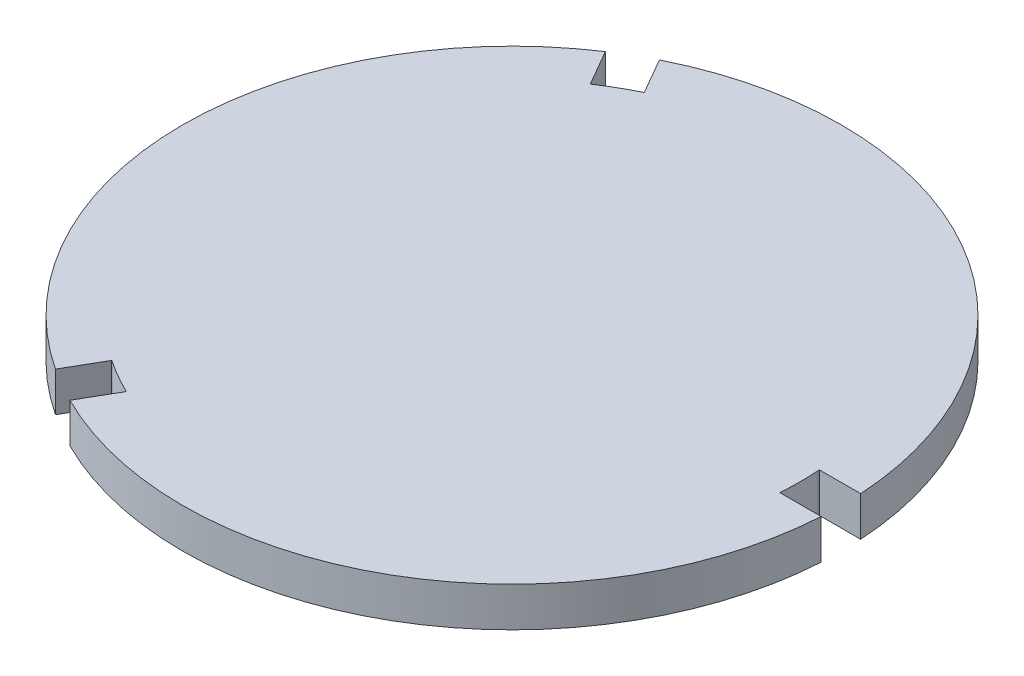
ISO-10303-21;
HEADER;
FILE_DESCRIPTION(('STEP AP214'),'2;1');
FILE_NAME('part.step','',(''),(''),'','','');
FILE_SCHEMA(('AUTOMOTIVE_DESIGN { 1 0 10303 214 1 1 1 1 }'));
ENDSEC;
DATA;
#1=APPLICATION_CONTEXT('core data for automotive mechanical design processes');
#2=APPLICATION_PROTOCOL_DEFINITION('international standard','automotive_design',2000,#1);
#3=PRODUCT_CONTEXT('',#1,'mechanical');
#4=PRODUCT('Part','Part','',(#3));
#5=PRODUCT_RELATED_PRODUCT_CATEGORY('part','',(#4));
#6=PRODUCT_DEFINITION_FORMATION('','',#4);
#7=PRODUCT_DEFINITION_CONTEXT('part definition',#1,'design');
#8=PRODUCT_DEFINITION('design','',#6,#7);
#9=PRODUCT_DEFINITION_SHAPE('','',#8);
#10=(LENGTH_UNIT() NAMED_UNIT(*) SI_UNIT(.MILLI.,.METRE.));
#11=(NAMED_UNIT(*) PLANE_ANGLE_UNIT() SI_UNIT($,.RADIAN.));
#12=(NAMED_UNIT(*) SI_UNIT($,.STERADIAN.) SOLID_ANGLE_UNIT());
#13=UNCERTAINTY_MEASURE_WITH_UNIT(LENGTH_MEASURE(1.E-05),#10,'distance_accuracy_value','');
#14=(GEOMETRIC_REPRESENTATION_CONTEXT(3) GLOBAL_UNCERTAINTY_ASSIGNED_CONTEXT((#13)) GLOBAL_UNIT_ASSIGNED_CONTEXT((#10,
#11,#12)) REPRESENTATION_CONTEXT('',''));
#15=CARTESIAN_POINT('',(0.,0.,0.));
#16=DIRECTION('',(0.,0.,1.));
#17=DIRECTION('',(1.,0.,0.));
#18=AXIS2_PLACEMENT_3D('',#15,#16,#17);
#19=CARTESIAN_POINT('',(0.,0.,0.));
#20=DIRECTION('',(0.,1.,0.));
#21=DIRECTION('',(-1.,0.,0.));
#22=AXIS2_PLACEMENT_3D('',#19,#20,#21);
#23=CYLINDRICAL_SURFACE('',#22,88.9);
#24=DIRECTION('',(0.,1.,0.));
#25=VECTOR('',#24,1.);
#26=CARTESIAN_POINT('',(-39.4204711900264,-1.54675011123543E-13,-79.6820961769725));
#27=LINE('',#26,#25);
#28=CARTESIAN_POINT('',(-39.4204711900234,-148.472222222158,-79.682096176974));
#29=VERTEX_POINT('',#28);
#30=CARTESIAN_POINT('',(-39.4204711900231,-136.280222222158,-79.6820961769741));
#31=VERTEX_POINT('',#30);
#32=EDGE_CURVE('E258',#29,#31,#27,.T.);
#33=ORIENTED_EDGE('',*,*,#32,.F.);
#34=CARTESIAN_POINT('',(0.,-148.472222222158,0.));
#35=DIRECTION('',(0.,1.,0.));
#36=DIRECTION('',(-1.,0.,0.));
#37=AXIS2_PLACEMENT_3D('',#34,#35,#36);
#38=CIRCLE('',#37,88.9);
#39=CARTESIAN_POINT('',(-49.2964839210414,-148.472222222158,-73.9801775682007));
#40=VERTEX_POINT('',#39);
#41=EDGE_CURVE('E259',#29,#40,#38,.T.);
#42=ORIENTED_EDGE('',*,*,#41,.T.);
#43=DIRECTION('',(0.,1.,0.));
#44=VECTOR('',#43,1.);
#45=CARTESIAN_POINT('',(-49.2964839210386,-1.55884473861481E-13,-73.9801775682026));
#46=LINE('',#45,#44);
#47=CARTESIAN_POINT('',(-49.2964839210416,-136.280222222158,-73.9801775682005));
#48=VERTEX_POINT('',#47);
#49=EDGE_CURVE('E51',#48,#40,#46,.F.);
#50=ORIENTED_EDGE('',*,*,#49,.F.);
#51=CARTESIAN_POINT('',(0.,-136.280222222158,0.));
#52=DIRECTION('',(0.,1.,0.));
#53=DIRECTION('',(-1.,0.,0.));
#54=AXIS2_PLACEMENT_3D('',#51,#52,#53);
#55=CIRCLE('',#54,88.9);
#56=EDGE_CURVE('E44',#31,#48,#55,.T.);
#57=ORIENTED_EDGE('',*,*,#56,.F.);
#58=EDGE_LOOP('',(#33,#42,#50,#57));
#59=FACE_BOUND('',#58,.T.);
#60=ADVANCED_FACE('F35',(#59),#23,.T.);
#61=DIRECTION('',(0.,1.,0.));
#62=VECTOR('',#61,1.);
#63=CARTESIAN_POINT('',(88.7169551110657,3.10559484985026E-13,5.70191860878083));
#64=LINE('',#63,#62);
#65=CARTESIAN_POINT('',(88.7169551110662,-148.472222222158,5.70191860877276));
#66=VERTEX_POINT('',#65);
#67=CARTESIAN_POINT('',(88.7169551110661,-136.280222222158,5.70191860877368));
#68=VERTEX_POINT('',#67);
#69=EDGE_CURVE('E254',#66,#68,#64,.T.);
#70=ORIENTED_EDGE('',*,*,#69,.F.);
#71=CARTESIAN_POINT('',(88.7169551110662,-148.472222222158,-5.70191860877276));
#72=VERTEX_POINT('',#71);
#73=EDGE_CURVE('E261',#66,#72,#38,.T.);
#74=ORIENTED_EDGE('',*,*,#73,.T.);
#75=DIRECTION('',(0.,1.,0.));
#76=VECTOR('',#75,1.);
#77=CARTESIAN_POINT('',(88.7169551110657,3.10559484985026E-13,-5.70191860878083));
#78=LINE('',#77,#76);
#79=CARTESIAN_POINT('',(88.7169551110661,-136.280222222158,-5.70191860877368));
#80=VERTEX_POINT('',#79);
#81=EDGE_CURVE('E251',#80,#72,#78,.F.);
#82=ORIENTED_EDGE('',*,*,#81,.F.);
#83=EDGE_CURVE('E43',#68,#80,#55,.T.);
#84=ORIENTED_EDGE('',*,*,#83,.F.);
#85=EDGE_LOOP('',(#70,#74,#82,#84));
#86=FACE_BOUND('',#85,.T.);
#87=ADVANCED_FACE('F325',(#86),#23,.T.);
#88=DIRECTION('',(0.,1.,0.));
#89=VECTOR('',#88,1.);
#90=CARTESIAN_POINT('',(-49.2964839210393,-1.55884473861484E-13,73.9801775682021));
#91=LINE('',#90,#89);
#92=CARTESIAN_POINT('',(-49.296483921042,-148.472222222158,73.9801775682003));
#93=VERTEX_POINT('',#92);
#94=CARTESIAN_POINT('',(-49.2964839210419,-136.280222222158,73.9801775682004));
#95=VERTEX_POINT('',#94);
#96=EDGE_CURVE('E248',#93,#95,#91,.T.);
#97=ORIENTED_EDGE('',*,*,#96,.F.);
#98=CARTESIAN_POINT('',(-39.4204711900249,-148.472222222158,79.6820961769733));
#99=VERTEX_POINT('',#98);
#100=EDGE_CURVE('E260',#93,#99,#38,.T.);
#101=ORIENTED_EDGE('',*,*,#100,.T.);
#102=DIRECTION('',(0.,1.,0.));
#103=VECTOR('',#102,1.);
#104=CARTESIAN_POINT('',(-39.4204711900277,-1.54675011123547E-13,79.6820961769719));
#105=LINE('',#104,#103);
#106=CARTESIAN_POINT('',(-39.420471190025,-136.280222222158,79.6820961769732));
#107=VERTEX_POINT('',#106);
#108=EDGE_CURVE('E245',#107,#99,#105,.F.);
#109=ORIENTED_EDGE('',*,*,#108,.F.);
#110=EDGE_CURVE('E11',#95,#107,#55,.T.);
#111=ORIENTED_EDGE('',*,*,#110,.F.);
#112=EDGE_LOOP('',(#97,#101,#109,#111));
#113=FACE_BOUND('',#112,.T.);
#114=ADVANCED_FACE('F306',(#113),#23,.T.);
#115=CARTESIAN_POINT('',(0.,-136.280222222158,0.));
#116=DIRECTION('',(0.,-1.,0.));
#117=DIRECTION('',(1.,0.,0.));
#118=AXIS2_PLACEMENT_3D('',#115,#116,#117);
#119=PLANE('',#118);
#120=DIRECTION('',(0.,0.,1.));
#121=VECTOR('',#120,1.);
#122=CARTESIAN_POINT('',(88.7169551110661,-136.280222222157,-6.096));
#123=LINE('',#122,#121);
#124=CARTESIAN_POINT('',(88.7169551110661,-136.280222222157,6.096));
#125=VERTEX_POINT('',#124);
#126=EDGE_CURVE('E198',#68,#125,#123,.T.);
#127=ORIENTED_EDGE('',*,*,#126,.F.);
#128=ORIENTED_EDGE('',*,*,#83,.T.);
#129=CARTESIAN_POINT('',(88.7169551110661,-136.280222222157,-6.096));
#130=VERTEX_POINT('',#129);
#131=EDGE_CURVE('E199',#130,#80,#123,.T.);
#132=ORIENTED_EDGE('',*,*,#131,.F.);
#133=DIRECTION('',(-1.,0.,0.));
#134=VECTOR('',#133,1.);
#135=CARTESIAN_POINT('',(101.416955111066,-136.280222222157,-6.096));
#136=LINE('',#135,#134);
#137=CARTESIAN_POINT('',(101.416955111066,-136.280222222157,-6.096));
#138=VERTEX_POINT('',#137);
#139=EDGE_CURVE('E195',#138,#130,#136,.T.);
#140=ORIENTED_EDGE('',*,*,#139,.F.);
#141=CARTESIAN_POINT('',(0.,-136.280222222158,0.));
#142=DIRECTION('',(0.,1.,0.));
#143=DIRECTION('',(-1.,0.,0.));
#144=AXIS2_PLACEMENT_3D('',#141,#142,#143);
#145=CIRCLE('',#144,101.6);
#146=CARTESIAN_POINT('',(-45.4291866940622,-136.280222222158,-90.8776595006498));
#147=VERTEX_POINT('',#146);
#148=EDGE_CURVE('E192',#138,#147,#145,.T.);
#149=ORIENTED_EDGE('',*,*,#148,.T.);
#150=DIRECTION('',(0.499999999999992,0.,0.866025403784443));
#151=VECTOR('',#150,1.);
#152=CARTESIAN_POINT('',(-45.4291866940623,-136.280222222158,-90.8776595006497));
#153=LINE('',#152,#151);
#154=CARTESIAN_POINT('',(-39.0791866940624,-136.280222222158,-79.8791368725873));
#155=VERTEX_POINT('',#154);
#156=EDGE_CURVE('E179',#147,#155,#153,.T.);
#157=ORIENTED_EDGE('',*,*,#156,.T.);
#158=DIRECTION('',(0.866025403784443,0.,-0.499999999999992));
#159=VECTOR('',#158,1.);
#160=CARTESIAN_POINT('',(-49.6377684170023,-136.280222222158,-73.7831368725874));
#161=LINE('',#160,#159);
#162=EDGE_CURVE('E180',#31,#155,#161,.T.);
#163=ORIENTED_EDGE('',*,*,#162,.F.);
#164=ORIENTED_EDGE('',*,*,#56,.T.);
#165=CARTESIAN_POINT('',(-49.6377684170023,-136.280222222158,-73.7831368725874));
#166=VERTEX_POINT('',#165);
#167=EDGE_CURVE('E162',#166,#48,#161,.T.);
#168=ORIENTED_EDGE('',*,*,#167,.F.);
#169=DIRECTION('',(0.499999999999992,0.,0.866025403784443));
#170=VECTOR('',#169,1.);
#171=CARTESIAN_POINT('',(-55.9877684170022,-136.280222222158,-84.7816595006498));
#172=LINE('',#171,#170);
#173=CARTESIAN_POINT('',(-55.9877684170022,-136.280222222158,-84.7816595006499));
#174=VERTEX_POINT('',#173);
#175=EDGE_CURVE('E176',#174,#166,#172,.T.);
#176=ORIENTED_EDGE('',*,*,#175,.F.);
#177=CARTESIAN_POINT('',(0.,-136.280222222158,0.));
#178=DIRECTION('',(0.,1.,0.));
#179=DIRECTION('',(-1.,0.,0.));
#180=AXIS2_PLACEMENT_3D('',#177,#178,#179);
#181=CIRCLE('',#180,101.6);
#182=CARTESIAN_POINT('',(-55.9877684170034,-136.280222222158,84.7816595006491));
#183=VERTEX_POINT('',#182);
#184=EDGE_CURVE('E218',#174,#183,#181,.T.);
#185=ORIENTED_EDGE('',*,*,#184,.T.);
#186=DIRECTION('',(0.500000000000004,0.,-0.866025403784436));
#187=VECTOR('',#186,1.);
#188=CARTESIAN_POINT('',(-55.9877684170034,-136.280222222158,84.7816595006491));
#189=LINE('',#188,#187);
#190=CARTESIAN_POINT('',(-49.6377684170033,-136.280222222158,73.7831368725868));
#191=VERTEX_POINT('',#190);
#192=EDGE_CURVE('E215',#183,#191,#189,.T.);
#193=ORIENTED_EDGE('',*,*,#192,.T.);
#194=DIRECTION('',(-0.866025403784436,0.,-0.500000000000004));
#195=VECTOR('',#194,1.);
#196=CARTESIAN_POINT('',(-39.0791866940635,-136.280222222158,79.8791368725868));
#197=LINE('',#196,#195);
#198=EDGE_CURVE('E211',#95,#191,#197,.T.);
#199=ORIENTED_EDGE('',*,*,#198,.F.);
#200=ORIENTED_EDGE('',*,*,#110,.T.);
#201=CARTESIAN_POINT('',(-39.0791866940635,-136.280222222158,79.8791368725868));
#202=VERTEX_POINT('',#201);
#203=EDGE_CURVE('E212',#202,#107,#197,.T.);
#204=ORIENTED_EDGE('',*,*,#203,.F.);
#205=DIRECTION('',(0.500000000000004,0.,-0.866025403784436));
#206=VECTOR('',#205,1.);
#207=CARTESIAN_POINT('',(-45.4291866940635,-136.280222222158,90.8776595006492));
#208=LINE('',#207,#206);
#209=CARTESIAN_POINT('',(-45.4291866940635,-136.280222222158,90.8776595006492));
#210=VERTEX_POINT('',#209);
#211=EDGE_CURVE('E208',#210,#202,#208,.T.);
#212=ORIENTED_EDGE('',*,*,#211,.F.);
#213=CARTESIAN_POINT('',(0.,-136.280222222158,0.));
#214=DIRECTION('',(0.,1.,0.));
#215=DIRECTION('',(-1.,0.,0.));
#216=AXIS2_PLACEMENT_3D('',#213,#214,#215);
#217=CIRCLE('',#216,101.6);
#218=CARTESIAN_POINT('',(101.416955111066,-136.280222222157,6.09599999999999));
#219=VERTEX_POINT('',#218);
#220=EDGE_CURVE('E205',#210,#219,#217,.T.);
#221=ORIENTED_EDGE('',*,*,#220,.T.);
#222=DIRECTION('',(-1.,0.,0.));
#223=VECTOR('',#222,1.);
#224=CARTESIAN_POINT('',(101.416955111066,-136.280222222157,6.096));
#225=LINE('',#224,#223);
#226=EDGE_CURVE('E202',#219,#125,#225,.T.);
#227=ORIENTED_EDGE('',*,*,#226,.T.);
#228=EDGE_LOOP('',(#127,#128,#132,#140,#149,#157,#163,#164,#168,#176,#185,#193,#199,#200,#204,
#212,#221,#227));
#229=FACE_BOUND('',#228,.T.);
#230=ADVANCED_FACE('F37',(#229),#119,.F.);
#231=CARTESIAN_POINT('',(0.,-148.472222222158,0.));
#232=DIRECTION('',(0.,1.,0.));
#233=DIRECTION('',(-1.,0.,0.));
#234=AXIS2_PLACEMENT_3D('',#231,#232,#233);
#235=PLANE('',#234);
#236=ORIENTED_EDGE('',*,*,#100,.F.);
#237=DIRECTION('',(0.866025403784436,0.,0.500000000000004));
#238=VECTOR('',#237,1.);
#239=CARTESIAN_POINT('',(-39.0791866940627,-148.472222222158,79.8791368725872));
#240=LINE('',#239,#238);
#241=CARTESIAN_POINT('',(-49.6377684170033,-148.472222222158,73.7831368725868));
#242=VERTEX_POINT('',#241);
#243=EDGE_CURVE('E287',#242,#93,#240,.T.);
#244=ORIENTED_EDGE('',*,*,#243,.F.);
#245=DIRECTION('',(-0.500000000000004,0.,0.866025403784437));
#246=VECTOR('',#245,1.);
#247=CARTESIAN_POINT('',(-55.9877684170031,-148.472222222158,84.7816595006487));
#248=LINE('',#247,#246);
#249=CARTESIAN_POINT('',(-55.9877684170033,-148.472222222158,84.7816595006491));
#250=VERTEX_POINT('',#249);
#251=EDGE_CURVE('E169',#242,#250,#248,.T.);
#252=ORIENTED_EDGE('',*,*,#251,.T.);
#253=CARTESIAN_POINT('',(0.,-148.472222222158,0.));
#254=DIRECTION('',(0.,1.,0.));
#255=DIRECTION('',(-1.,0.,0.));
#256=AXIS2_PLACEMENT_3D('',#253,#254,#255);
#257=CIRCLE('',#256,101.6);
#258=CARTESIAN_POINT('',(-55.9877684170019,-148.472222222158,-84.7816595006501));
#259=VERTEX_POINT('',#258);
#260=EDGE_CURVE('E243',#250,#259,#257,.F.);
#261=ORIENTED_EDGE('',*,*,#260,.T.);
#262=DIRECTION('',(-0.499999999999992,0.,-0.866025403784443));
#263=VECTOR('',#262,1.);
#264=CARTESIAN_POINT('',(-55.9877684170019,-148.472222222158,-84.7816595006494));
#265=LINE('',#264,#263);
#266=CARTESIAN_POINT('',(-49.6377684170023,-148.472222222158,-73.7831368725874));
#267=VERTEX_POINT('',#266);
#268=EDGE_CURVE('E187',#267,#259,#265,.T.);
#269=ORIENTED_EDGE('',*,*,#268,.F.);
#270=DIRECTION('',(-0.866025403784443,0.,0.499999999999993));
#271=VECTOR('',#270,1.);
#272=CARTESIAN_POINT('',(-49.6377684170015,-148.472222222158,-73.7831368725878));
#273=LINE('',#272,#271);
#274=EDGE_CURVE('E164',#40,#267,#273,.T.);
#275=ORIENTED_EDGE('',*,*,#274,.F.);
#276=ORIENTED_EDGE('',*,*,#41,.F.);
#277=CARTESIAN_POINT('',(-39.0791866940623,-148.472222222158,-79.8791368725873));
#278=VERTEX_POINT('',#277);
#279=EDGE_CURVE('E267',#278,#29,#273,.T.);
#280=ORIENTED_EDGE('',*,*,#279,.F.);
#281=DIRECTION('',(-0.499999999999992,0.,-0.866025403784443));
#282=VECTOR('',#281,1.);
#283=CARTESIAN_POINT('',(-45.429186694062,-148.472222222158,-90.8776595006493));
#284=LINE('',#283,#282);
#285=CARTESIAN_POINT('',(-45.4291866940618,-148.472222222158,-90.8776595006499));
#286=VERTEX_POINT('',#285);
#287=EDGE_CURVE('E268',#278,#286,#284,.T.);
#288=ORIENTED_EDGE('',*,*,#287,.T.);
#289=CARTESIAN_POINT('',(0.,-148.472222222158,0.));
#290=DIRECTION('',(0.,1.,0.));
#291=DIRECTION('',(-1.,0.,0.));
#292=AXIS2_PLACEMENT_3D('',#289,#290,#291);
#293=CIRCLE('',#292,101.6);
#294=CARTESIAN_POINT('',(101.416955111067,-148.472222222158,-6.096));
#295=VERTEX_POINT('',#294);
#296=EDGE_CURVE('E269',#286,#295,#293,.F.);
#297=ORIENTED_EDGE('',*,*,#296,.T.);
#298=DIRECTION('',(1.,0.,0.));
#299=VECTOR('',#298,1.);
#300=CARTESIAN_POINT('',(101.416955111067,-148.472222222158,-6.096));
#301=LINE('',#300,#299);
#302=CARTESIAN_POINT('',(88.7169551110662,-148.472222222158,-6.096));
#303=VERTEX_POINT('',#302);
#304=EDGE_CURVE('E273',#303,#295,#301,.T.);
#305=ORIENTED_EDGE('',*,*,#304,.F.);
#306=DIRECTION('',(0.,0.,-1.));
#307=VECTOR('',#306,1.);
#308=CARTESIAN_POINT('',(88.7169551110662,-148.472222222158,-6.096));
#309=LINE('',#308,#307);
#310=EDGE_CURVE('E279',#72,#303,#309,.T.);
#311=ORIENTED_EDGE('',*,*,#310,.F.);
#312=ORIENTED_EDGE('',*,*,#73,.F.);
#313=CARTESIAN_POINT('',(88.7169551110661,-148.472222222158,6.096));
#314=VERTEX_POINT('',#313);
#315=EDGE_CURVE('E276',#314,#66,#309,.T.);
#316=ORIENTED_EDGE('',*,*,#315,.F.);
#317=DIRECTION('',(1.,0.,0.));
#318=VECTOR('',#317,1.);
#319=CARTESIAN_POINT('',(101.416955111067,-148.472222222158,6.096));
#320=LINE('',#319,#318);
#321=CARTESIAN_POINT('',(101.416955111066,-148.472222222158,6.09599999999996));
#322=VERTEX_POINT('',#321);
#323=EDGE_CURVE('E280',#314,#322,#320,.T.);
#324=ORIENTED_EDGE('',*,*,#323,.T.);
#325=CARTESIAN_POINT('',(0.,-148.472222222158,0.));
#326=DIRECTION('',(0.,1.,0.));
#327=DIRECTION('',(-1.,0.,0.));
#328=AXIS2_PLACEMENT_3D('',#325,#326,#327);
#329=CIRCLE('',#328,101.6);
#330=CARTESIAN_POINT('',(-45.4291866940635,-148.472222222158,90.8776595006492));
#331=VERTEX_POINT('',#330);
#332=EDGE_CURVE('E282',#322,#331,#329,.F.);
#333=ORIENTED_EDGE('',*,*,#332,.T.);
#334=DIRECTION('',(-0.500000000000004,0.,0.866025403784437));
#335=VECTOR('',#334,1.);
#336=CARTESIAN_POINT('',(-45.4291866940633,-148.472222222158,90.8776595006487));
#337=LINE('',#336,#335);
#338=CARTESIAN_POINT('',(-39.0791866940624,-148.472222222158,79.8791368725874));
#339=VERTEX_POINT('',#338);
#340=EDGE_CURVE('E284',#339,#331,#337,.T.);
#341=ORIENTED_EDGE('',*,*,#340,.F.);
#342=EDGE_CURVE('E290',#99,#339,#240,.T.);
#343=ORIENTED_EDGE('',*,*,#342,.F.);
#344=EDGE_LOOP('',(#236,#244,#252,#261,#269,#275,#276,#280,#288,#297,#305,#311,#312,#316,#324,
#333,#341,#343));
#345=FACE_BOUND('',#344,.T.);
#346=ADVANCED_FACE('F266',(#345),#235,.F.);
#347=CARTESIAN_POINT('',(-55.9877684170011,-435.711014975798,-84.7816595006498));
#348=DIRECTION('',(-0.866025403784443,0.,0.499999999999992));
#349=DIRECTION('',(0.499999999999992,0.,0.866025403784443));
#350=AXIS2_PLACEMENT_3D('',#347,#348,#349);
#351=PLANE('',#350);
#352=DIRECTION('',(0.,1.,0.));
#353=VECTOR('',#352,1.);
#354=CARTESIAN_POINT('',(-49.6377684170012,-435.711014975798,-73.7831368725874));
#355=LINE('',#354,#353);
#356=EDGE_CURVE('E159',#267,#166,#355,.T.);
#357=ORIENTED_EDGE('',*,*,#356,.F.);
#358=ORIENTED_EDGE('',*,*,#268,.T.);
#359=DIRECTION('',(0.,1.,0.));
#360=VECTOR('',#359,1.);
#361=CARTESIAN_POINT('',(-55.9877684170012,-435.711014975798,-84.7816595006499));
#362=LINE('',#361,#360);
#363=EDGE_CURVE('E184',#259,#174,#362,.T.);
#364=ORIENTED_EDGE('',*,*,#363,.T.);
#365=ORIENTED_EDGE('',*,*,#175,.T.);
#366=EDGE_LOOP('',(#357,#358,#364,#365));
#367=FACE_BOUND('',#366,.T.);
#368=ADVANCED_FACE('F182',(#367),#351,.F.);
#369=CARTESIAN_POINT('',(1.06486652426214E-12,-435.711014975798,0.));
#370=DIRECTION('',(0.,1.,0.));
#371=DIRECTION('',(-1.,0.,0.));
#372=AXIS2_PLACEMENT_3D('',#369,#370,#371);
#373=CYLINDRICAL_SURFACE('',#372,101.6);
#374=ORIENTED_EDGE('',*,*,#260,.F.);
#375=DIRECTION('',(0.,1.,0.));
#376=VECTOR('',#375,1.);
#377=CARTESIAN_POINT('',(-55.9877684170023,-435.711014975798,84.7816595006491));
#378=LINE('',#377,#376);
#379=EDGE_CURVE('E221',#250,#183,#378,.T.);
#380=ORIENTED_EDGE('',*,*,#379,.T.);
#381=ORIENTED_EDGE('',*,*,#184,.F.);
#382=ORIENTED_EDGE('',*,*,#363,.F.);
#383=EDGE_LOOP('',(#374,#380,#381,#382));
#384=FACE_BOUND('',#383,.T.);
#385=ADVANCED_FACE('F315',(#384),#373,.T.);
#386=CARTESIAN_POINT('',(-55.9877684170023,-435.711014975798,84.7816595006491));
#387=DIRECTION('',(0.866025403784436,0.,0.500000000000004));
#388=DIRECTION('',(0.500000000000004,0.,-0.866025403784437));
#389=AXIS2_PLACEMENT_3D('',#386,#387,#388);
#390=PLANE('',#389);
#391=ORIENTED_EDGE('',*,*,#251,.F.);
#392=DIRECTION('',(0.,1.,0.));
#393=VECTOR('',#392,1.);
#394=CARTESIAN_POINT('',(-49.6377684170023,-435.711014975798,73.7831368725868));
#395=LINE('',#394,#393);
#396=EDGE_CURVE('E223',#242,#191,#395,.T.);
#397=ORIENTED_EDGE('',*,*,#396,.T.);
#398=ORIENTED_EDGE('',*,*,#192,.F.);
#399=ORIENTED_EDGE('',*,*,#379,.F.);
#400=EDGE_LOOP('',(#391,#397,#398,#399));
#401=FACE_BOUND('',#400,.T.);
#402=ADVANCED_FACE('F311',(#401),#390,.T.);
#403=CARTESIAN_POINT('',(-39.0791866940624,-435.711014975798,79.8791368725868));
#404=DIRECTION('',(0.500000000000004,0.,-0.866025403784436));
#405=DIRECTION('',(-0.866025403784436,0.,-0.500000000000004));
#406=AXIS2_PLACEMENT_3D('',#403,#404,#405);
#407=PLANE('',#406);
#408=ORIENTED_EDGE('',*,*,#243,.T.);
#409=ORIENTED_EDGE('',*,*,#96,.T.);
#410=ORIENTED_EDGE('',*,*,#198,.T.);
#411=ORIENTED_EDGE('',*,*,#396,.F.);
#412=EDGE_LOOP('',(#408,#409,#410,#411));
#413=FACE_BOUND('',#412,.T.);
#414=ADVANCED_FACE('F308',(#413),#407,.F.);
#415=CARTESIAN_POINT('',(-49.6377684170012,-435.711014975798,-73.7831368725874));
#416=DIRECTION('',(0.499999999999993,0.,0.866025403784443));
#417=DIRECTION('',(0.866025403784443,0.,-0.499999999999993));
#418=AXIS2_PLACEMENT_3D('',#415,#416,#417);
#419=PLANE('',#418);
#420=ORIENTED_EDGE('',*,*,#167,.T.);
#421=ORIENTED_EDGE('',*,*,#49,.T.);
#422=ORIENTED_EDGE('',*,*,#274,.T.);
#423=ORIENTED_EDGE('',*,*,#356,.T.);
#424=EDGE_LOOP('',(#420,#421,#422,#423));
#425=FACE_BOUND('',#424,.T.);
#426=ADVANCED_FACE('F161',(#425),#419,.F.);
#427=CARTESIAN_POINT('',(101.416955111067,-435.711014975798,-6.096));
#428=DIRECTION('',(0.,0.,-1.));
#429=DIRECTION('',(-1.,0.,0.));
#430=AXIS2_PLACEMENT_3D('',#427,#428,#429);
#431=PLANE('',#430);
#432=DIRECTION('',(0.,1.,0.));
#433=VECTOR('',#432,1.);
#434=CARTESIAN_POINT('',(88.7169551110672,-435.711014975798,-6.096));
#435=LINE('',#434,#433);
#436=EDGE_CURVE('E235',#303,#130,#435,.T.);
#437=ORIENTED_EDGE('',*,*,#436,.F.);
#438=ORIENTED_EDGE('',*,*,#304,.T.);
#439=DIRECTION('',(0.,1.,0.));
#440=VECTOR('',#439,1.);
#441=CARTESIAN_POINT('',(101.416955111067,-435.711014975798,-6.096));
#442=LINE('',#441,#440);
#443=EDGE_CURVE('E237',#295,#138,#442,.T.);
#444=ORIENTED_EDGE('',*,*,#443,.T.);
#445=ORIENTED_EDGE('',*,*,#139,.T.);
#446=EDGE_LOOP('',(#437,#438,#444,#445));
#447=FACE_BOUND('',#446,.T.);
#448=ADVANCED_FACE('F354',(#447),#431,.F.);
#449=CARTESIAN_POINT('',(1.06486652426214E-12,-435.711014975798,0.));
#450=DIRECTION('',(0.,1.,0.));
#451=DIRECTION('',(-1.,0.,0.));
#452=AXIS2_PLACEMENT_3D('',#449,#450,#451);
#453=CYLINDRICAL_SURFACE('',#452,101.6);
#454=ORIENTED_EDGE('',*,*,#296,.F.);
#455=DIRECTION('',(0.,1.,0.));
#456=VECTOR('',#455,1.);
#457=CARTESIAN_POINT('',(-45.4291866940612,-435.711014975798,-90.8776595006498));
#458=LINE('',#457,#456);
#459=EDGE_CURVE('E239',#286,#147,#458,.T.);
#460=ORIENTED_EDGE('',*,*,#459,.T.);
#461=ORIENTED_EDGE('',*,*,#148,.F.);
#462=ORIENTED_EDGE('',*,*,#443,.F.);
#463=EDGE_LOOP('',(#454,#460,#461,#462));
#464=FACE_BOUND('',#463,.T.);
#465=ADVANCED_FACE('F350',(#464),#453,.T.);
#466=CARTESIAN_POINT('',(-45.4291866940612,-435.711014975798,-90.8776595006497));
#467=DIRECTION('',(-0.866025403784443,0.,0.499999999999992));
#468=DIRECTION('',(0.499999999999992,0.,0.866025403784443));
#469=AXIS2_PLACEMENT_3D('',#466,#467,#468);
#470=PLANE('',#469);
#471=ORIENTED_EDGE('',*,*,#287,.F.);
#472=DIRECTION('',(0.,1.,0.));
#473=VECTOR('',#472,1.);
#474=CARTESIAN_POINT('',(-39.0791866940613,-435.711014975798,-79.8791368725873));
#475=LINE('',#474,#473);
#476=EDGE_CURVE('E170',#278,#155,#475,.T.);
#477=ORIENTED_EDGE('',*,*,#476,.T.);
#478=ORIENTED_EDGE('',*,*,#156,.F.);
#479=ORIENTED_EDGE('',*,*,#459,.F.);
#480=EDGE_LOOP('',(#471,#477,#478,#479));
#481=FACE_BOUND('',#480,.T.);
#482=ADVANCED_FACE('F347',(#481),#470,.T.);
#483=CARTESIAN_POINT('',(88.7169551110672,-435.711014975798,-6.096));
#484=DIRECTION('',(-1.,0.,0.));
#485=DIRECTION('',(0.,-1.,0.));
#486=AXIS2_PLACEMENT_3D('',#483,#484,#485);
#487=PLANE('',#486);
#488=ORIENTED_EDGE('',*,*,#131,.T.);
#489=ORIENTED_EDGE('',*,*,#81,.T.);
#490=ORIENTED_EDGE('',*,*,#310,.T.);
#491=ORIENTED_EDGE('',*,*,#436,.T.);
#492=EDGE_LOOP('',(#488,#489,#490,#491));
#493=FACE_BOUND('',#492,.T.);
#494=ADVANCED_FACE('F345',(#493),#487,.F.);
#495=ORIENTED_EDGE('',*,*,#279,.T.);
#496=ORIENTED_EDGE('',*,*,#32,.T.);
#497=ORIENTED_EDGE('',*,*,#162,.T.);
#498=ORIENTED_EDGE('',*,*,#476,.F.);
#499=EDGE_LOOP('',(#495,#496,#497,#498));
#500=FACE_BOUND('',#499,.T.);
#501=ADVANCED_FACE('F341',(#500),#419,.F.);
#502=ORIENTED_EDGE('',*,*,#315,.T.);
#503=ORIENTED_EDGE('',*,*,#69,.T.);
#504=ORIENTED_EDGE('',*,*,#126,.T.);
#505=DIRECTION('',(0.,1.,0.));
#506=VECTOR('',#505,1.);
#507=CARTESIAN_POINT('',(88.7169551110672,-435.711014975798,6.096));
#508=LINE('',#507,#506);
#509=EDGE_CURVE('E232',#314,#125,#508,.T.);
#510=ORIENTED_EDGE('',*,*,#509,.F.);
#511=EDGE_LOOP('',(#502,#503,#504,#510));
#512=FACE_BOUND('',#511,.T.);
#513=ADVANCED_FACE('F344',(#512),#487,.F.);
#514=ORIENTED_EDGE('',*,*,#203,.T.);
#515=ORIENTED_EDGE('',*,*,#108,.T.);
#516=ORIENTED_EDGE('',*,*,#342,.T.);
#517=DIRECTION('',(0.,1.,0.));
#518=VECTOR('',#517,1.);
#519=CARTESIAN_POINT('',(-39.0791866940624,-435.711014975798,79.8791368725868));
#520=LINE('',#519,#518);
#521=EDGE_CURVE('E226',#339,#202,#520,.T.);
#522=ORIENTED_EDGE('',*,*,#521,.T.);
#523=EDGE_LOOP('',(#514,#515,#516,#522));
#524=FACE_BOUND('',#523,.T.);
#525=ADVANCED_FACE('F296',(#524),#407,.F.);
#526=CARTESIAN_POINT('',(101.416955111067,-435.711014975798,6.096));
#527=DIRECTION('',(0.,0.,-1.));
#528=DIRECTION('',(-1.,0.,0.));
#529=AXIS2_PLACEMENT_3D('',#526,#527,#528);
#530=PLANE('',#529);
#531=ORIENTED_EDGE('',*,*,#323,.F.);
#532=ORIENTED_EDGE('',*,*,#509,.T.);
#533=ORIENTED_EDGE('',*,*,#226,.F.);
#534=DIRECTION('',(0.,1.,0.));
#535=VECTOR('',#534,1.);
#536=CARTESIAN_POINT('',(101.416955111067,-435.711014975798,6.09599999999999));
#537=LINE('',#536,#535);
#538=EDGE_CURVE('E230',#322,#219,#537,.T.);
#539=ORIENTED_EDGE('',*,*,#538,.F.);
#540=EDGE_LOOP('',(#531,#532,#533,#539));
#541=FACE_BOUND('',#540,.T.);
#542=ADVANCED_FACE('F362',(#541),#530,.T.);
#543=CARTESIAN_POINT('',(1.06486652426214E-12,-435.711014975798,0.));
#544=DIRECTION('',(0.,1.,0.));
#545=DIRECTION('',(-1.,0.,0.));
#546=AXIS2_PLACEMENT_3D('',#543,#544,#545);
#547=CYLINDRICAL_SURFACE('',#546,101.6);
#548=ORIENTED_EDGE('',*,*,#332,.F.);
#549=ORIENTED_EDGE('',*,*,#538,.T.);
#550=ORIENTED_EDGE('',*,*,#220,.F.);
#551=DIRECTION('',(0.,1.,0.));
#552=VECTOR('',#551,1.);
#553=CARTESIAN_POINT('',(-45.4291866940625,-435.711014975798,90.8776595006492));
#554=LINE('',#553,#552);
#555=EDGE_CURVE('E228',#331,#210,#554,.T.);
#556=ORIENTED_EDGE('',*,*,#555,.F.);
#557=EDGE_LOOP('',(#548,#549,#550,#556));
#558=FACE_BOUND('',#557,.T.);
#559=ADVANCED_FACE('F365',(#558),#547,.T.);
#560=CARTESIAN_POINT('',(-45.4291866940625,-435.711014975798,90.8776595006492));
#561=DIRECTION('',(0.866025403784436,0.,0.500000000000004));
#562=DIRECTION('',(0.500000000000004,0.,-0.866025403784437));
#563=AXIS2_PLACEMENT_3D('',#560,#561,#562);
#564=PLANE('',#563);
#565=ORIENTED_EDGE('',*,*,#521,.F.);
#566=ORIENTED_EDGE('',*,*,#340,.T.);
#567=ORIENTED_EDGE('',*,*,#555,.T.);
#568=ORIENTED_EDGE('',*,*,#211,.T.);
#569=EDGE_LOOP('',(#565,#566,#567,#568));
#570=FACE_BOUND('',#569,.T.);
#571=ADVANCED_FACE('F301',(#570),#564,.F.);
#572=CLOSED_SHELL('',(#60,#87,#114,#230,#346,#368,#385,#402,#414,#426,#448,#465,#482,#494,#501,
#513,#525,#542,#559,#571));
#573=MANIFOLD_SOLID_BREP('B2',#572);
#574=ADVANCED_BREP_SHAPE_REPRESENTATION('',(#18,#573),#14);
#575=SHAPE_DEFINITION_REPRESENTATION(#9,#574);
ENDSEC;
END-ISO-10303-21;
